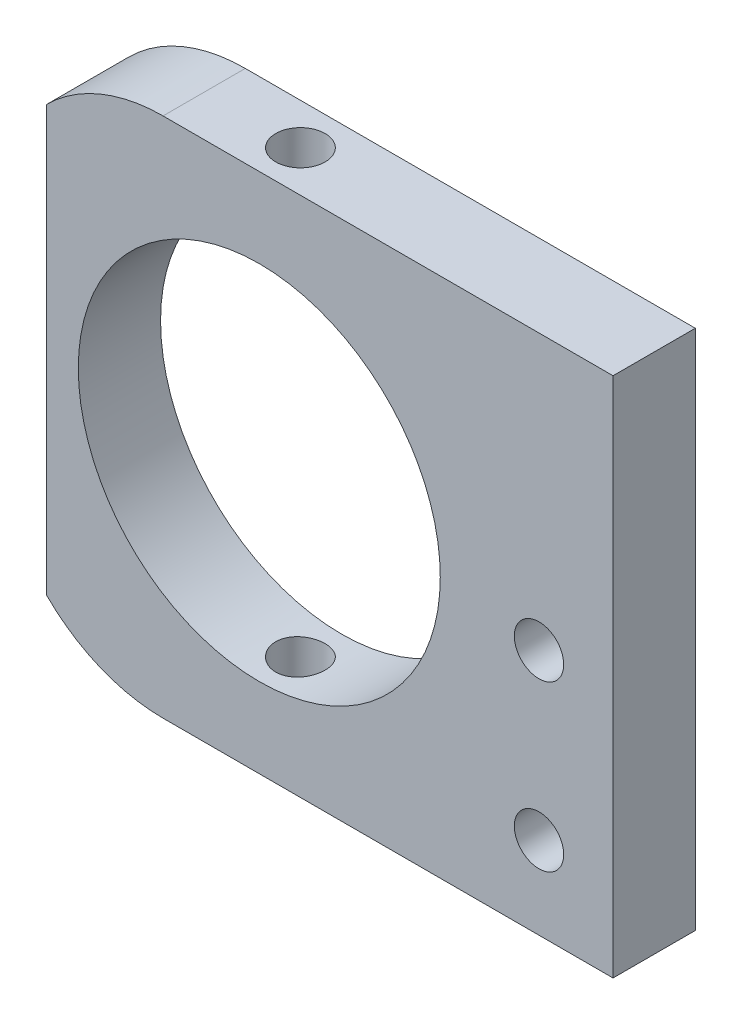
ISO-10303-21;
HEADER;
FILE_DESCRIPTION(('STEP AP214'),'2;1');
FILE_NAME('part.step','',(''),(''),'','','');
FILE_SCHEMA(('AUTOMOTIVE_DESIGN { 1 0 10303 214 1 1 1 1 }'));
ENDSEC;
DATA;
#1=APPLICATION_CONTEXT('core data for automotive mechanical design processes');
#2=APPLICATION_PROTOCOL_DEFINITION('international standard','automotive_design',2000,#1);
#3=PRODUCT_CONTEXT('',#1,'mechanical');
#4=PRODUCT('Part','Part','',(#3));
#5=PRODUCT_RELATED_PRODUCT_CATEGORY('part','',(#4));
#6=PRODUCT_DEFINITION_FORMATION('','',#4);
#7=PRODUCT_DEFINITION_CONTEXT('part definition',#1,'design');
#8=PRODUCT_DEFINITION('design','',#6,#7);
#9=PRODUCT_DEFINITION_SHAPE('','',#8);
#10=(LENGTH_UNIT() NAMED_UNIT(*) SI_UNIT(.MILLI.,.METRE.));
#11=(NAMED_UNIT(*) PLANE_ANGLE_UNIT() SI_UNIT($,.RADIAN.));
#12=(NAMED_UNIT(*) SI_UNIT($,.STERADIAN.) SOLID_ANGLE_UNIT());
#13=UNCERTAINTY_MEASURE_WITH_UNIT(LENGTH_MEASURE(1.E-05),#10,'distance_accuracy_value','');
#14=(GEOMETRIC_REPRESENTATION_CONTEXT(3) GLOBAL_UNCERTAINTY_ASSIGNED_CONTEXT((#13)) GLOBAL_UNIT_ASSIGNED_CONTEXT((#10,
#11,#12)) REPRESENTATION_CONTEXT('',''));
#15=CARTESIAN_POINT('',(0.,0.,0.));
#16=DIRECTION('',(0.,0.,1.));
#17=DIRECTION('',(1.,0.,0.));
#18=AXIS2_PLACEMENT_3D('',#15,#16,#17);
#19=CARTESIAN_POINT('',(112.251450395313,101.173573784225,5.));
#20=DIRECTION('',(0.,0.,-1.));
#21=DIRECTION('',(-1.,0.,0.));
#22=AXIS2_PLACEMENT_3D('',#19,#20,#21);
#23=PLANE('',#22);
#24=CARTESIAN_POINT('',(112.251450395313,101.173573784225,5.));
#25=DIRECTION('',(0.,0.,1.));
#26=DIRECTION('',(-1.,0.,0.));
#27=AXIS2_PLACEMENT_3D('',#24,#25,#26);
#28=CIRCLE('',#27,9.99999999999999);
#29=CARTESIAN_POINT('',(105.180382583447,94.1025059723593,5.));
#30=VERTEX_POINT('',#29);
#31=CARTESIAN_POINT('',(112.251450395313,91.1735737842248,5.));
#32=VERTEX_POINT('',#31);
#33=EDGE_CURVE('E148',#30,#32,#28,.T.);
#34=ORIENTED_EDGE('',*,*,#33,.T.);
#35=DIRECTION('',(1.,0.,0.));
#36=VECTOR('',#35,1.);
#37=CARTESIAN_POINT('',(112.251450395313,91.1735737842248,5.));
#38=LINE('',#37,#36);
#39=CARTESIAN_POINT('',(139.601450395313,91.173573784225,5.));
#40=VERTEX_POINT('',#39);
#41=EDGE_CURVE('E106',#32,#40,#38,.T.);
#42=ORIENTED_EDGE('',*,*,#41,.T.);
#43=DIRECTION('',(0.,1.,0.));
#44=VECTOR('',#43,1.);
#45=CARTESIAN_POINT('',(139.601450395313,91.173573784225,5.));
#46=LINE('',#45,#44);
#47=CARTESIAN_POINT('',(139.601450395313,122.873573784225,5.));
#48=VERTEX_POINT('',#47);
#49=EDGE_CURVE('E119',#40,#48,#46,.T.);
#50=ORIENTED_EDGE('',*,*,#49,.T.);
#51=DIRECTION('',(-1.,0.,0.));
#52=VECTOR('',#51,1.);
#53=CARTESIAN_POINT('',(133.951450395313,122.873573784225,5.));
#54=LINE('',#53,#52);
#55=CARTESIAN_POINT('',(112.251450395313,122.873573784225,5.));
#56=VERTEX_POINT('',#55);
#57=EDGE_CURVE('E113',#48,#56,#54,.T.);
#58=ORIENTED_EDGE('',*,*,#57,.T.);
#59=CARTESIAN_POINT('',(112.251450395313,112.873573784225,5.));
#60=DIRECTION('',(0.,0.,1.));
#61=DIRECTION('',(-1.,0.,0.));
#62=AXIS2_PLACEMENT_3D('',#59,#60,#61);
#63=CIRCLE('',#62,10.);
#64=CARTESIAN_POINT('',(105.180382583447,119.94464159609,5.));
#65=VERTEX_POINT('',#64);
#66=EDGE_CURVE('E117',#56,#65,#63,.T.);
#67=ORIENTED_EDGE('',*,*,#66,.T.);
#68=DIRECTION('',(0.,-1.,0.));
#69=VECTOR('',#68,1.);
#70=CARTESIAN_POINT('',(105.180382583447,119.94464159609,5.));
#71=LINE('',#70,#69);
#72=EDGE_CURVE('E69',#65,#30,#71,.T.);
#73=ORIENTED_EDGE('',*,*,#72,.T.);
#74=EDGE_LOOP('',(#34,#42,#50,#58,#67,#73));
#75=FACE_BOUND('',#74,.T.);
#76=CARTESIAN_POINT('',(118.101450395313,107.023573784225,5.));
#77=DIRECTION('',(0.,0.,1.));
#78=DIRECTION('',(1.,0.,0.));
#79=AXIS2_PLACEMENT_3D('',#76,#77,#78);
#80=CIRCLE('',#79,11.);
#81=CARTESIAN_POINT('',(129.101450395313,107.023573784225,5.));
#82=VERTEX_POINT('',#81);
#83=EDGE_CURVE('E140',#82,#82,#80,.T.);
#84=ORIENTED_EDGE('',*,*,#83,.F.);
#85=EDGE_LOOP('',(#84));
#86=FACE_BOUND('',#85,.T.);
#87=CARTESIAN_POINT('',(135.101450395313,106.173573784225,5.));
#88=DIRECTION('',(0.,0.,1.));
#89=DIRECTION('',(1.,0.,0.));
#90=AXIS2_PLACEMENT_3D('',#87,#88,#89);
#91=CIRCLE('',#90,1.5);
#92=CARTESIAN_POINT('',(136.601450395313,106.173573784225,5.));
#93=VERTEX_POINT('',#92);
#94=EDGE_CURVE('E222',#93,#93,#91,.T.);
#95=ORIENTED_EDGE('',*,*,#94,.F.);
#96=EDGE_LOOP('',(#95));
#97=FACE_BOUND('',#96,.T.);
#98=CARTESIAN_POINT('',(135.101450395313,96.1735737842248,5.));
#99=DIRECTION('',(0.,0.,1.));
#100=DIRECTION('',(1.,0.,0.));
#101=AXIS2_PLACEMENT_3D('',#98,#99,#100);
#102=CIRCLE('',#101,1.5);
#103=CARTESIAN_POINT('',(136.601450395313,96.1735737842248,5.));
#104=VERTEX_POINT('',#103);
#105=EDGE_CURVE('E228',#104,#104,#102,.T.);
#106=ORIENTED_EDGE('',*,*,#105,.F.);
#107=EDGE_LOOP('',(#106));
#108=FACE_BOUND('',#107,.T.);
#109=ADVANCED_FACE('F45',(#75,#86,#97,#108),#23,.F.);
#110=CARTESIAN_POINT('',(112.251450395313,101.173573784225,0.));
#111=DIRECTION('',(0.,0.,-1.));
#112=DIRECTION('',(-1.,0.,0.));
#113=AXIS2_PLACEMENT_3D('',#110,#111,#112);
#114=PLANE('',#113);
#115=CARTESIAN_POINT('',(135.101450395313,106.173573784225,0.));
#116=DIRECTION('',(0.,0.,1.));
#117=DIRECTION('',(1.,0.,0.));
#118=AXIS2_PLACEMENT_3D('',#115,#116,#117);
#119=CIRCLE('',#118,1.5);
#120=CARTESIAN_POINT('',(136.601450395313,106.173573784225,0.));
#121=VERTEX_POINT('',#120);
#122=EDGE_CURVE('E225',#121,#121,#119,.T.);
#123=ORIENTED_EDGE('',*,*,#122,.T.);
#124=EDGE_LOOP('',(#123));
#125=FACE_BOUND('',#124,.T.);
#126=CARTESIAN_POINT('',(112.251450395313,101.173573784225,0.));
#127=DIRECTION('',(0.,0.,1.));
#128=DIRECTION('',(-1.,0.,0.));
#129=AXIS2_PLACEMENT_3D('',#126,#127,#128);
#130=CIRCLE('',#129,9.99999999999999);
#131=CARTESIAN_POINT('',(105.180382583447,94.1025059723593,0.));
#132=VERTEX_POINT('',#131);
#133=CARTESIAN_POINT('',(112.251450395313,91.1735737842248,0.));
#134=VERTEX_POINT('',#133);
#135=EDGE_CURVE('E136',#132,#134,#130,.T.);
#136=ORIENTED_EDGE('',*,*,#135,.F.);
#137=DIRECTION('',(0.,-1.,0.));
#138=VECTOR('',#137,1.);
#139=CARTESIAN_POINT('',(105.180382583447,119.94464159609,0.));
#140=LINE('',#139,#138);
#141=CARTESIAN_POINT('',(105.180382583447,119.94464159609,0.));
#142=VERTEX_POINT('',#141);
#143=EDGE_CURVE('E98',#142,#132,#140,.T.);
#144=ORIENTED_EDGE('',*,*,#143,.F.);
#145=CARTESIAN_POINT('',(112.251450395313,112.873573784225,0.));
#146=DIRECTION('',(0.,0.,1.));
#147=DIRECTION('',(-1.,0.,0.));
#148=AXIS2_PLACEMENT_3D('',#145,#146,#147);
#149=CIRCLE('',#148,10.);
#150=CARTESIAN_POINT('',(112.251450395313,122.873573784225,0.));
#151=VERTEX_POINT('',#150);
#152=EDGE_CURVE('E92',#151,#142,#149,.T.);
#153=ORIENTED_EDGE('',*,*,#152,.F.);
#154=DIRECTION('',(-1.,0.,0.));
#155=VECTOR('',#154,1.);
#156=CARTESIAN_POINT('',(133.951450395313,122.873573784225,0.));
#157=LINE('',#156,#155);
#158=CARTESIAN_POINT('',(139.601450395313,122.873573784225,0.));
#159=VERTEX_POINT('',#158);
#160=EDGE_CURVE('E126',#159,#151,#157,.T.);
#161=ORIENTED_EDGE('',*,*,#160,.F.);
#162=DIRECTION('',(0.,1.,0.));
#163=VECTOR('',#162,1.);
#164=CARTESIAN_POINT('',(139.601450395313,91.173573784225,0.));
#165=LINE('',#164,#163);
#166=CARTESIAN_POINT('',(139.601450395313,91.173573784225,0.));
#167=VERTEX_POINT('',#166);
#168=EDGE_CURVE('E142',#167,#159,#165,.T.);
#169=ORIENTED_EDGE('',*,*,#168,.F.);
#170=DIRECTION('',(1.,0.,0.));
#171=VECTOR('',#170,1.);
#172=CARTESIAN_POINT('',(133.951450395313,91.1735737842249,0.));
#173=LINE('',#172,#171);
#174=EDGE_CURVE('E139',#134,#167,#173,.T.);
#175=ORIENTED_EDGE('',*,*,#174,.F.);
#176=EDGE_LOOP('',(#136,#144,#153,#161,#169,#175));
#177=FACE_BOUND('',#176,.T.);
#178=CARTESIAN_POINT('',(118.101450395313,107.023573784225,0.));
#179=DIRECTION('',(0.,0.,1.));
#180=DIRECTION('',(1.,0.,0.));
#181=AXIS2_PLACEMENT_3D('',#178,#179,#180);
#182=CIRCLE('',#181,11.);
#183=CARTESIAN_POINT('',(129.101450395313,107.023573784225,0.));
#184=VERTEX_POINT('',#183);
#185=EDGE_CURVE('E219',#184,#184,#182,.T.);
#186=ORIENTED_EDGE('',*,*,#185,.T.);
#187=EDGE_LOOP('',(#186));
#188=FACE_BOUND('',#187,.T.);
#189=CARTESIAN_POINT('',(135.101450395313,96.1735737842248,0.));
#190=DIRECTION('',(0.,0.,1.));
#191=DIRECTION('',(1.,0.,0.));
#192=AXIS2_PLACEMENT_3D('',#189,#190,#191);
#193=CIRCLE('',#192,1.5);
#194=CARTESIAN_POINT('',(136.601450395313,96.1735737842248,0.));
#195=VERTEX_POINT('',#194);
#196=EDGE_CURVE('E230',#195,#195,#193,.T.);
#197=ORIENTED_EDGE('',*,*,#196,.T.);
#198=EDGE_LOOP('',(#197));
#199=FACE_BOUND('',#198,.T.);
#200=ADVANCED_FACE('F184',(#125,#177,#188,#199),#114,.T.);
#201=CARTESIAN_POINT('',(112.251450395313,101.173573784225,5.));
#202=DIRECTION('',(0.,0.,-1.));
#203=DIRECTION('',(-1.,0.,0.));
#204=AXIS2_PLACEMENT_3D('',#201,#202,#203);
#205=CYLINDRICAL_SURFACE('',#204,9.99999999999999);
#206=ORIENTED_EDGE('',*,*,#135,.T.);
#207=DIRECTION('',(0.,0.,-1.));
#208=VECTOR('',#207,1.);
#209=CARTESIAN_POINT('',(112.251450395313,91.1735737842248,5.));
#210=LINE('',#209,#208);
#211=EDGE_CURVE('E13',#32,#134,#210,.T.);
#212=ORIENTED_EDGE('',*,*,#211,.F.);
#213=ORIENTED_EDGE('',*,*,#33,.F.);
#214=DIRECTION('',(0.,0.,-1.));
#215=VECTOR('',#214,1.);
#216=CARTESIAN_POINT('',(105.180382583447,94.1025059723593,5.));
#217=LINE('',#216,#215);
#218=EDGE_CURVE('E132',#30,#132,#217,.T.);
#219=ORIENTED_EDGE('',*,*,#218,.T.);
#220=EDGE_LOOP('',(#206,#212,#213,#219));
#221=FACE_BOUND('',#220,.T.);
#222=ADVANCED_FACE('F47',(#221),#205,.T.);
#223=CARTESIAN_POINT('',(133.951450395313,91.1735737842249,5.));
#224=DIRECTION('',(0.,1.,0.));
#225=DIRECTION('',(-1.,0.,0.));
#226=AXIS2_PLACEMENT_3D('',#223,#224,#225);
#227=PLANE('',#226);
#228=CARTESIAN_POINT('',(118.101450395312,91.173573784224,2.5));
#229=DIRECTION('',(0.,-1.,0.));
#230=DIRECTION('',(0.,0.,-1.));
#231=AXIS2_PLACEMENT_3D('',#228,#229,#230);
#232=CIRCLE('',#231,1.5);
#233=CARTESIAN_POINT('',(118.101450395312,91.173573784224,1.));
#234=VERTEX_POINT('',#233);
#235=EDGE_CURVE('E158',#234,#234,#232,.T.);
#236=ORIENTED_EDGE('',*,*,#235,.F.);
#237=EDGE_LOOP('',(#236));
#238=FACE_BOUND('',#237,.T.);
#239=ORIENTED_EDGE('',*,*,#174,.T.);
#240=DIRECTION('',(0.,0.,-1.));
#241=VECTOR('',#240,1.);
#242=CARTESIAN_POINT('',(139.601450395313,91.173573784225,5.));
#243=LINE('',#242,#241);
#244=EDGE_CURVE('E60',#40,#167,#243,.T.);
#245=ORIENTED_EDGE('',*,*,#244,.F.);
#246=ORIENTED_EDGE('',*,*,#41,.F.);
#247=ORIENTED_EDGE('',*,*,#211,.T.);
#248=EDGE_LOOP('',(#239,#245,#246,#247));
#249=FACE_BOUND('',#248,.T.);
#250=ADVANCED_FACE('F200',(#238,#249),#227,.F.);
#251=CARTESIAN_POINT('',(139.601450395313,91.173573784225,5.));
#252=DIRECTION('',(-1.,0.,0.));
#253=DIRECTION('',(0.,0.,1.));
#254=AXIS2_PLACEMENT_3D('',#251,#252,#253);
#255=PLANE('',#254);
#256=ORIENTED_EDGE('',*,*,#168,.T.);
#257=DIRECTION('',(0.,0.,-1.));
#258=VECTOR('',#257,1.);
#259=CARTESIAN_POINT('',(139.601450395313,122.873573784225,5.));
#260=LINE('',#259,#258);
#261=EDGE_CURVE('E127',#48,#159,#260,.T.);
#262=ORIENTED_EDGE('',*,*,#261,.F.);
#263=ORIENTED_EDGE('',*,*,#49,.F.);
#264=ORIENTED_EDGE('',*,*,#244,.T.);
#265=EDGE_LOOP('',(#256,#262,#263,#264));
#266=FACE_BOUND('',#265,.T.);
#267=ADVANCED_FACE('F197',(#266),#255,.F.);
#268=CARTESIAN_POINT('',(133.951450395313,122.873573784225,5.));
#269=DIRECTION('',(0.,-1.,0.));
#270=DIRECTION('',(1.,0.,0.));
#271=AXIS2_PLACEMENT_3D('',#268,#269,#270);
#272=PLANE('',#271);
#273=CARTESIAN_POINT('',(118.101450395312,122.873573784225,2.5));
#274=DIRECTION('',(0.,-1.,0.));
#275=DIRECTION('',(1.,0.,0.));
#276=AXIS2_PLACEMENT_3D('',#273,#274,#275);
#277=CIRCLE('',#276,1.5);
#278=CARTESIAN_POINT('',(119.601450395312,122.873573784225,2.5));
#279=VERTEX_POINT('',#278);
#280=EDGE_CURVE('E233',#279,#279,#277,.T.);
#281=ORIENTED_EDGE('',*,*,#280,.T.);
#282=EDGE_LOOP('',(#281));
#283=FACE_BOUND('',#282,.T.);
#284=ORIENTED_EDGE('',*,*,#160,.T.);
#285=DIRECTION('',(0.,0.,-1.));
#286=VECTOR('',#285,1.);
#287=CARTESIAN_POINT('',(112.251450395313,122.873573784225,5.));
#288=LINE('',#287,#286);
#289=EDGE_CURVE('E124',#56,#151,#288,.T.);
#290=ORIENTED_EDGE('',*,*,#289,.F.);
#291=ORIENTED_EDGE('',*,*,#57,.F.);
#292=ORIENTED_EDGE('',*,*,#261,.T.);
#293=EDGE_LOOP('',(#284,#290,#291,#292));
#294=FACE_BOUND('',#293,.T.);
#295=ADVANCED_FACE('F125',(#283,#294),#272,.F.);
#296=CARTESIAN_POINT('',(112.251450395313,112.873573784225,5.));
#297=DIRECTION('',(0.,0.,-1.));
#298=DIRECTION('',(-1.,0.,0.));
#299=AXIS2_PLACEMENT_3D('',#296,#297,#298);
#300=CYLINDRICAL_SURFACE('',#299,10.);
#301=ORIENTED_EDGE('',*,*,#152,.T.);
#302=DIRECTION('',(0.,0.,-1.));
#303=VECTOR('',#302,1.);
#304=CARTESIAN_POINT('',(105.180382583447,119.94464159609,5.));
#305=LINE('',#304,#303);
#306=EDGE_CURVE('E128',#65,#142,#305,.T.);
#307=ORIENTED_EDGE('',*,*,#306,.F.);
#308=ORIENTED_EDGE('',*,*,#66,.F.);
#309=ORIENTED_EDGE('',*,*,#289,.T.);
#310=EDGE_LOOP('',(#301,#307,#308,#309));
#311=FACE_BOUND('',#310,.T.);
#312=ADVANCED_FACE('F130',(#311),#300,.T.);
#313=CARTESIAN_POINT('',(105.180382583447,119.94464159609,5.));
#314=DIRECTION('',(1.,0.,0.));
#315=DIRECTION('',(0.,1.,0.));
#316=AXIS2_PLACEMENT_3D('',#313,#314,#315);
#317=PLANE('',#316);
#318=ORIENTED_EDGE('',*,*,#143,.T.);
#319=ORIENTED_EDGE('',*,*,#218,.F.);
#320=ORIENTED_EDGE('',*,*,#72,.F.);
#321=ORIENTED_EDGE('',*,*,#306,.T.);
#322=EDGE_LOOP('',(#318,#319,#320,#321));
#323=FACE_BOUND('',#322,.T.);
#324=ADVANCED_FACE('F179',(#323),#317,.F.);
#325=CARTESIAN_POINT('',(118.101450395313,107.023573784225,5.));
#326=DIRECTION('',(0.,0.,-1.));
#327=DIRECTION('',(-1.,0.,0.));
#328=AXIS2_PLACEMENT_3D('',#325,#326,#327);
#329=CYLINDRICAL_SURFACE('',#328,11.);
#330=CARTESIAN_POINT('',(118.101450395312,118.023573784225,1.));
#331=CARTESIAN_POINT('',(118.185288808742,118.023572530951,1.00000351945738));
#332=CARTESIAN_POINT('',(118.269177997602,118.022605211374,1.00705259267257));
#333=CARTESIAN_POINT('',(118.434617492953,118.018839448309,1.03505888322429));
#334=CARTESIAN_POINT('',(118.516165340972,118.016039148626,1.05603019944984));
#335=CARTESIAN_POINT('',(118.674503489006,118.008922558208,1.11124773384062));
#336=CARTESIAN_POINT('',(118.751297117765,118.004607342617,1.14548453920208));
#337=CARTESIAN_POINT('',(118.898035697762,117.994939511448,1.22623952456021));
#338=CARTESIAN_POINT('',(118.967981724171,117.989587059125,1.27275577225428));
#339=CARTESIAN_POINT('',(119.099507959124,117.978402383917,1.37707221429231));
#340=CARTESIAN_POINT('',(119.161037179936,117.972567553277,1.43493642300347));
#341=CARTESIAN_POINT('',(119.273543734392,117.961096499818,1.5601686107924));
#342=CARTESIAN_POINT('',(119.32452050144,117.955460287677,1.62753709986133));
#343=CARTESIAN_POINT('',(119.414668900561,117.944999161944,1.77020193822412));
#344=CARTESIAN_POINT('',(119.453792059996,117.940177614333,1.84552918500522));
#345=CARTESIAN_POINT('',(119.518813040165,117.931926724902,2.00176181537368));
#346=CARTESIAN_POINT('',(119.544711456392,117.928497320398,2.08266694760981));
#347=CARTESIAN_POINT('',(119.582391300863,117.923444281147,2.24722624357359));
#348=CARTESIAN_POINT('',(119.594259383957,117.92180956647,2.33086021929106));
#349=CARTESIAN_POINT('',(119.603809945909,117.920497222273,2.49894747302408));
#350=CARTESIAN_POINT('',(119.601493100292,117.920819499556,2.58340071183276));
#351=CARTESIAN_POINT('',(119.582810565504,117.92337458759,2.7501217256009));
#352=CARTESIAN_POINT('',(119.566540784488,117.925594355245,2.83240047636717));
#353=CARTESIAN_POINT('',(119.520564072265,117.931673958307,2.99304904053265));
#354=CARTESIAN_POINT('',(119.490856821815,117.93553383268,3.07141876101297));
#355=CARTESIAN_POINT('',(119.418746812914,117.944473367162,3.22231992603762));
#356=CARTESIAN_POINT('',(119.37630283389,117.949556976982,3.29483142926801));
#357=CARTESIAN_POINT('',(119.27995362576,117.960368227572,3.43173914888578));
#358=CARTESIAN_POINT('',(119.226047773542,117.966095903347,3.49613492376674));
#359=CARTESIAN_POINT('',(119.10777567315,117.977607758123,3.61553955449458));
#360=CARTESIAN_POINT('',(119.043326846046,117.983392013636,3.67046664031243));
#361=CARTESIAN_POINT('',(118.906081339717,117.994321254803,3.76873649159838));
#362=CARTESIAN_POINT('',(118.833284634477,117.999466238465,3.81207922096304));
#363=CARTESIAN_POINT('',(118.681343364792,118.008541325102,3.88595186318003));
#364=CARTESIAN_POINT('',(118.602196027443,118.01247089371,3.91647614239271));
#365=CARTESIAN_POINT('',(118.439833483252,118.018667736255,3.96377783794559));
#366=CARTESIAN_POINT('',(118.356618503592,118.020935102917,3.98055602109349));
#367=CARTESIAN_POINT('',(118.18918930268,118.023539922262,3.99978208456558));
#368=CARTESIAN_POINT('',(118.1049882317,118.023892531126,4.0023425085886));
#369=CARTESIAN_POINT('',(117.937358101223,118.022669171935,3.99335812166926));
#370=CARTESIAN_POINT('',(117.853929022132,118.021093252963,3.98181366971708));
#371=CARTESIAN_POINT('',(117.690547016947,118.016199310804,3.94504077679034));
#372=CARTESIAN_POINT('',(117.610581674691,118.012888185458,3.91986650442867));
#373=CARTESIAN_POINT('',(117.456007254216,118.004894224861,3.85660524096708));
#374=CARTESIAN_POINT('',(117.381398388887,118.000211335128,3.81851773698282));
#375=CARTESIAN_POINT('',(117.23915550233,117.989957414585,3.73024246127597));
#376=CARTESIAN_POINT('',(117.171566666959,117.984381154796,3.67998249719963));
#377=CARTESIAN_POINT('',(117.045743382057,117.972979315651,3.56889042204265));
#378=CARTESIAN_POINT('',(116.987509377859,117.967153724444,3.50805780794334));
#379=CARTESIAN_POINT('',(116.881645065771,117.955862471955,3.3770491669916));
#380=CARTESIAN_POINT('',(116.834089731506,117.950399534346,3.30681228651894));
#381=CARTESIAN_POINT('',(116.751451999819,117.940498434666,3.15928169230024));
#382=CARTESIAN_POINT('',(116.716369313351,117.936060248848,3.08198814214142));
#383=CARTESIAN_POINT('',(116.65979190026,117.928730256831,2.9227722433268));
#384=CARTESIAN_POINT('',(116.638256124812,117.925833783197,2.84086470556386));
#385=CARTESIAN_POINT('',(116.609252289837,117.921902215827,2.67455347817196));
#386=CARTESIAN_POINT('',(116.601783440333,117.920867017566,2.59014992898565));
#387=CARTESIAN_POINT('',(116.601141829465,117.920778638377,2.42198902460904));
#388=CARTESIAN_POINT('',(116.607851248406,117.921709122845,2.3382321033916));
#389=CARTESIAN_POINT('',(116.635124930927,117.925411984761,2.17304886130151));
#390=CARTESIAN_POINT('',(116.6556891866,117.928184361158,2.09162253909885));
#391=CARTESIAN_POINT('',(116.710049830807,117.935253292423,1.93343486061486));
#392=CARTESIAN_POINT('',(116.743839425505,117.939549064618,1.85667113251747));
#393=CARTESIAN_POINT('',(116.823679996921,117.94918189547,1.70988370139365));
#394=CARTESIAN_POINT('',(116.869731241654,117.954518976887,1.63986014573946));
#395=CARTESIAN_POINT('',(116.973221243081,117.965686083443,1.50793996340022));
#396=CARTESIAN_POINT('',(117.030747611078,117.971519689828,1.44611236377749));
#397=CARTESIAN_POINT('',(117.155370527258,117.98299165726,1.33294465328922));
#398=CARTESIAN_POINT('',(117.222469313354,117.988629972266,1.28160700168864));
#399=CARTESIAN_POINT('',(117.36468490211,117.999104713924,1.19067403261664));
#400=CARTESIAN_POINT('',(117.439836576795,118.003937400681,1.15113284172368));
#401=CARTESIAN_POINT('',(117.595740701382,118.012219154796,1.08529051894703));
#402=CARTESIAN_POINT('',(117.67648708329,118.015669694502,1.0589752903063));
#403=CARTESIAN_POINT('',(117.814931798225,118.019985544898,1.02648956293606));
#404=CARTESIAN_POINT('',(117.871764606616,118.021324427013,1.01657063920266));
#405=CARTESIAN_POINT('',(117.986207081665,118.023118973299,1.00332467901879));
#406=CARTESIAN_POINT('',(118.043816741014,118.023574645772,0.999997580593652));
#407=CARTESIAN_POINT('',(118.101450395312,118.023573784225,1.));
#408=B_SPLINE_CURVE_WITH_KNOTS('',3,(#330,#331,#332,#333,#334,#335,#336,#337,#338,#339,#340,
#341,#342,#343,#344,#345,#346,#347,#348,#349,#350,#351,#352,#353,#354,#355,#356,#357,#358,#359,
#360,#361,#362,#363,#364,#365,#366,#367,#368,#369,#370,#371,#372,#373,#374,#375,#376,#377,#378,
#379,#380,#381,#382,#383,#384,#385,#386,#387,#388,#389,#390,#391,#392,#393,#394,#395,#396,#397,
#398,#399,#400,#401,#402,#403,#404,#405,#406,#407),.UNSPECIFIED.,.T.,.F.,(4,2,2,2,2,2,2,2,2,2,2,
2,2,2,2,2,2,2,2,2,2,2,2,2,2,2,2,2,2,2,2,2,2,2,2,2,2,2,4),(0.,0.251304688086144,
0.502864258429491,0.754245655375295,1.00558751830523,1.25839025869503,1.51120656941611,
1.76504317927172,2.01886835818388,2.27111752000616,2.5233546691019,2.77387178872722,
3.02439486038873,3.27573762185033,3.52709405079553,3.78052284746838,4.03395243396008,
4.28749328511459,4.54101999186669,4.79253696204823,5.04404753088008,5.29456578809542,
5.5450939964948,5.7971460769789,6.04921015271751,6.30299215129405,6.55676826820728,
6.80977166004951,7.06276084317858,7.31365598745058,7.56455098853989,7.81531727406238,
8.06608904128418,8.31885423544369,8.57167862009407,8.82564582024674,9.07934175494257,
9.25209960062619,9.42485582207672),.UNSPECIFIED.);
#409=CARTESIAN_POINT('',(118.101450395312,118.023573784225,1.));
#410=VERTEX_POINT('',#409);
#411=EDGE_CURVE('E49',#410,#410,#408,.T.);
#412=ORIENTED_EDGE('',*,*,#411,.F.);
#413=EDGE_LOOP('',(#412));
#414=FACE_BOUND('',#413,.T.);
#415=CARTESIAN_POINT('',(118.101450395312,96.0235737842248,1.));
#416=CARTESIAN_POINT('',(118.017611981882,96.0235750374986,1.00000351945738));
#417=CARTESIAN_POINT('',(117.933722793022,96.024542357076,1.00705259267256));
#418=CARTESIAN_POINT('',(117.768283297671,96.0283081201403,1.03505888322428));
#419=CARTESIAN_POINT('',(117.686735449652,96.0311084198238,1.05603019944984));
#420=CARTESIAN_POINT('',(117.528397301618,96.0382250102419,1.11124773384062));
#421=CARTESIAN_POINT('',(117.451603672859,96.0425402258329,1.14548453920208));
#422=CARTESIAN_POINT('',(117.304865092862,96.0522080570019,1.22623952456021));
#423=CARTESIAN_POINT('',(117.234919066453,96.0575605093243,1.27275577225428));
#424=CARTESIAN_POINT('',(117.1033928315,96.0687451845323,1.37707221429231));
#425=CARTESIAN_POINT('',(117.041863610688,96.0745800151726,1.43493642300346));
#426=CARTESIAN_POINT('',(116.929357056232,96.0860510686317,1.56016861079239));
#427=CARTESIAN_POINT('',(116.878380289184,96.0916872807724,1.62753709986133));
#428=CARTESIAN_POINT('',(116.788231890063,96.102148406506,1.77020193822412));
#429=CARTESIAN_POINT('',(116.749108730628,96.1069699541168,1.84552918500522));
#430=CARTESIAN_POINT('',(116.684087750459,96.1152208435473,2.00176181537368));
#431=CARTESIAN_POINT('',(116.658189334232,96.1186502480519,2.08266694760981));
#432=CARTESIAN_POINT('',(116.620509489761,96.1237032873032,2.2472262435736));
#433=CARTESIAN_POINT('',(116.608641406666,96.12533800198,2.33086021929107));
#434=CARTESIAN_POINT('',(116.599090844715,96.1266503461766,2.49894747302408));
#435=CARTESIAN_POINT('',(116.601407690332,96.1263280688941,2.58340071183276));
#436=CARTESIAN_POINT('',(116.62009022512,96.1237729808593,2.7501217256009));
#437=CARTESIAN_POINT('',(116.636360006136,96.1215532132052,2.83240047636717));
#438=CARTESIAN_POINT('',(116.682336718359,96.1154736101431,2.99304904053265));
#439=CARTESIAN_POINT('',(116.712043968809,96.1116137357699,3.07141876101296));
#440=CARTESIAN_POINT('',(116.78415397771,96.1026742012879,3.22231992603762));
#441=CARTESIAN_POINT('',(116.826597956734,96.0975905914674,3.29483142926801));
#442=CARTESIAN_POINT('',(116.922947164864,96.086779340878,3.43173914888577));
#443=CARTESIAN_POINT('',(116.976853017082,96.0810516651031,3.49613492376673));
#444=CARTESIAN_POINT('',(117.095125117474,96.0695398103269,3.61553955449458));
#445=CARTESIAN_POINT('',(117.159573944578,96.063755554814,3.67046664031243));
#446=CARTESIAN_POINT('',(117.296819450907,96.0528263136469,3.76873649159838));
#447=CARTESIAN_POINT('',(117.369616156147,96.0476813299851,3.81207922096304));
#448=CARTESIAN_POINT('',(117.521557425832,96.0386062433477,3.88595186318003));
#449=CARTESIAN_POINT('',(117.600704763181,96.0346766747401,3.91647614239271));
#450=CARTESIAN_POINT('',(117.763067307372,96.0284798321941,3.96377783794559));
#451=CARTESIAN_POINT('',(117.846282287032,96.0262124655328,3.98055602109348));
#452=CARTESIAN_POINT('',(118.013711487944,96.0236076461873,3.99978208456558));
#453=CARTESIAN_POINT('',(118.097912558924,96.0232550373234,4.0023425085886));
#454=CARTESIAN_POINT('',(118.265542689401,96.0244783965149,3.99335812166926));
#455=CARTESIAN_POINT('',(118.348971768492,96.0260543154864,3.98181366971708));
#456=CARTESIAN_POINT('',(118.512353773677,96.0309482576456,3.94504077679034));
#457=CARTESIAN_POINT('',(118.592319115933,96.0342593829916,3.91986650442867));
#458=CARTESIAN_POINT('',(118.746893536408,96.0422533435884,3.85660524096708));
#459=CARTESIAN_POINT('',(118.821502401737,96.0469362333216,3.81851773698283));
#460=CARTESIAN_POINT('',(118.963745288294,96.0571901538644,3.73024246127597));
#461=CARTESIAN_POINT('',(119.031334123665,96.0627664136537,3.67998249719963));
#462=CARTESIAN_POINT('',(119.157157408567,96.0741682527979,3.56889042204264));
#463=CARTESIAN_POINT('',(119.215391412765,96.0799938440055,3.50805780794333));
#464=CARTESIAN_POINT('',(119.321255724853,96.0912850964944,3.3770491669916));
#465=CARTESIAN_POINT('',(119.368811059118,96.0967480341033,3.30681228651893));
#466=CARTESIAN_POINT('',(119.451448790805,96.1066491337831,3.15928169230024));
#467=CARTESIAN_POINT('',(119.486531477273,96.1110873196012,3.08198814214142));
#468=CARTESIAN_POINT('',(119.543108890363,96.118417311618,2.92277224332681));
#469=CARTESIAN_POINT('',(119.564644665812,96.1213137852527,2.84086470556387));
#470=CARTESIAN_POINT('',(119.593648500787,96.1252453526224,2.67455347817197));
#471=CARTESIAN_POINT('',(119.601117350291,96.1262805508837,2.59014992898565));
#472=CARTESIAN_POINT('',(119.601758961159,96.1263689300719,2.42198902460904));
#473=CARTESIAN_POINT('',(119.595049542218,96.1254384456042,2.3382321033916));
#474=CARTESIAN_POINT('',(119.567775859697,96.1217355836882,2.17304886130151));
#475=CARTESIAN_POINT('',(119.547211604024,96.1189632072912,2.09162253909885));
#476=CARTESIAN_POINT('',(119.492850959817,96.1118942760268,1.93343486061486));
#477=CARTESIAN_POINT('',(119.459061365119,96.1075985038317,1.85667113251747));
#478=CARTESIAN_POINT('',(119.379220793703,96.0979656729797,1.70988370139364));
#479=CARTESIAN_POINT('',(119.33316954897,96.0926285915624,1.63986014573945));
#480=CARTESIAN_POINT('',(119.229679547543,96.0814614850062,1.50793996340022));
#481=CARTESIAN_POINT('',(119.172153179546,96.0756278786211,1.44611236377749));
#482=CARTESIAN_POINT('',(119.047530263366,96.0641559111891,1.33294465328922));
#483=CARTESIAN_POINT('',(118.98043147727,96.0585175961832,1.28160700168864));
#484=CARTESIAN_POINT('',(118.838215888514,96.0480428545255,1.19067403261664));
#485=CARTESIAN_POINT('',(118.763064213829,96.0432101677685,1.15113284172368));
#486=CARTESIAN_POINT('',(118.607160089242,96.0349284136532,1.08529051894702));
#487=CARTESIAN_POINT('',(118.526413707334,96.0314778739475,1.0589752903063));
#488=CARTESIAN_POINT('',(118.387968992399,96.0271620235517,1.02648956293606));
#489=CARTESIAN_POINT('',(118.331136184008,96.0258231414361,1.01657063920265));
#490=CARTESIAN_POINT('',(118.216693708959,96.0240285951509,1.00332467901879));
#491=CARTESIAN_POINT('',(118.15908404961,96.0235729226776,0.999997580593652));
#492=CARTESIAN_POINT('',(118.101450395312,96.0235737842248,1.));
#493=B_SPLINE_CURVE_WITH_KNOTS('',3,(#415,#416,#417,#418,#419,#420,#421,#422,#423,#424,#425,
#426,#427,#428,#429,#430,#431,#432,#433,#434,#435,#436,#437,#438,#439,#440,#441,#442,#443,#444,
#445,#446,#447,#448,#449,#450,#451,#452,#453,#454,#455,#456,#457,#458,#459,#460,#461,#462,#463,
#464,#465,#466,#467,#468,#469,#470,#471,#472,#473,#474,#475,#476,#477,#478,#479,#480,#481,#482,
#483,#484,#485,#486,#487,#488,#489,#490,#491,#492),.UNSPECIFIED.,.T.,.F.,(4,2,2,2,2,2,2,2,2,2,2,
2,2,2,2,2,2,2,2,2,2,2,2,2,2,2,2,2,2,2,2,2,2,2,2,2,2,2,4),(0.,0.25130468808613,0.502864258429492,
0.754245655375299,1.00558751830524,1.25839025869504,1.51120656941612,1.76504317927173,
2.0188683581839,2.27111752000618,2.52335466910192,2.77387178872723,3.02439486038874,
3.27573762185033,3.52709405079552,3.7805228474684,4.03395243396009,4.2874932851146,
4.54101999186669,4.79253696204823,5.04404753088009,5.29456578809544,5.54509399649482,
5.79714607697891,6.04921015271752,6.30299215129406,6.55676826820728,6.80977166004951,
7.06276084317858,7.31365598745059,7.5645509885399,7.81531727406239,8.0660890412842,
8.31885423544367,8.57167862009409,8.82564582024675,9.07934175494258,9.25209960062625,
9.42485582207672),.UNSPECIFIED.);
#494=CARTESIAN_POINT('',(118.101450395312,96.0235737842248,1.));
#495=VERTEX_POINT('',#494);
#496=EDGE_CURVE('E153',#495,#495,#493,.T.);
#497=ORIENTED_EDGE('',*,*,#496,.F.);
#498=EDGE_LOOP('',(#497));
#499=FACE_BOUND('',#498,.T.);
#500=ORIENTED_EDGE('',*,*,#83,.T.);
#501=EDGE_LOOP('',(#500));
#502=FACE_BOUND('',#501,.T.);
#503=ORIENTED_EDGE('',*,*,#185,.F.);
#504=EDGE_LOOP('',(#503));
#505=FACE_BOUND('',#504,.T.);
#506=ADVANCED_FACE('F159',(#414,#499,#502,#505),#329,.F.);
#507=CARTESIAN_POINT('',(135.101450395313,106.173573784225,5.));
#508=DIRECTION('',(0.,0.,-1.));
#509=DIRECTION('',(-1.,0.,0.));
#510=AXIS2_PLACEMENT_3D('',#507,#508,#509);
#511=CYLINDRICAL_SURFACE('',#510,1.5);
#512=ORIENTED_EDGE('',*,*,#94,.T.);
#513=EDGE_LOOP('',(#512));
#514=FACE_BOUND('',#513,.T.);
#515=ORIENTED_EDGE('',*,*,#122,.F.);
#516=EDGE_LOOP('',(#515));
#517=FACE_BOUND('',#516,.T.);
#518=ADVANCED_FACE('F172',(#514,#517),#511,.F.);
#519=CARTESIAN_POINT('',(135.101450395313,96.1735737842248,5.));
#520=DIRECTION('',(0.,0.,-1.));
#521=DIRECTION('',(-1.,0.,0.));
#522=AXIS2_PLACEMENT_3D('',#519,#520,#521);
#523=CYLINDRICAL_SURFACE('',#522,1.5);
#524=ORIENTED_EDGE('',*,*,#105,.T.);
#525=EDGE_LOOP('',(#524));
#526=FACE_BOUND('',#525,.T.);
#527=ORIENTED_EDGE('',*,*,#196,.F.);
#528=EDGE_LOOP('',(#527));
#529=FACE_BOUND('',#528,.T.);
#530=ADVANCED_FACE('F168',(#526,#529),#523,.F.);
#531=CARTESIAN_POINT('',(118.101450395312,126.173573784224,2.5));
#532=DIRECTION('',(0.,-1.,0.));
#533=DIRECTION('',(0.,0.,-1.));
#534=AXIS2_PLACEMENT_3D('',#531,#532,#533);
#535=CYLINDRICAL_SURFACE('',#534,1.5);
#536=ORIENTED_EDGE('',*,*,#496,.T.);
#537=EDGE_LOOP('',(#536));
#538=FACE_BOUND('',#537,.T.);
#539=ORIENTED_EDGE('',*,*,#235,.T.);
#540=EDGE_LOOP('',(#539));
#541=FACE_BOUND('',#540,.T.);
#542=ADVANCED_FACE('F163',(#538,#541),#535,.F.);
#543=ORIENTED_EDGE('',*,*,#411,.T.);
#544=EDGE_LOOP('',(#543));
#545=FACE_BOUND('',#544,.T.);
#546=ORIENTED_EDGE('',*,*,#280,.F.);
#547=EDGE_LOOP('',(#546));
#548=FACE_BOUND('',#547,.T.);
#549=ADVANCED_FACE('F167',(#545,#548),#535,.F.);
#550=CLOSED_SHELL('',(#109,#200,#222,#250,#267,#295,#312,#324,#506,#518,#530,#542,#549));
#551=MANIFOLD_SOLID_BREP('B2',#550);
#552=ADVANCED_BREP_SHAPE_REPRESENTATION('',(#18,#551),#14);
#553=SHAPE_DEFINITION_REPRESENTATION(#9,#552);
ENDSEC;
END-ISO-10303-21;
